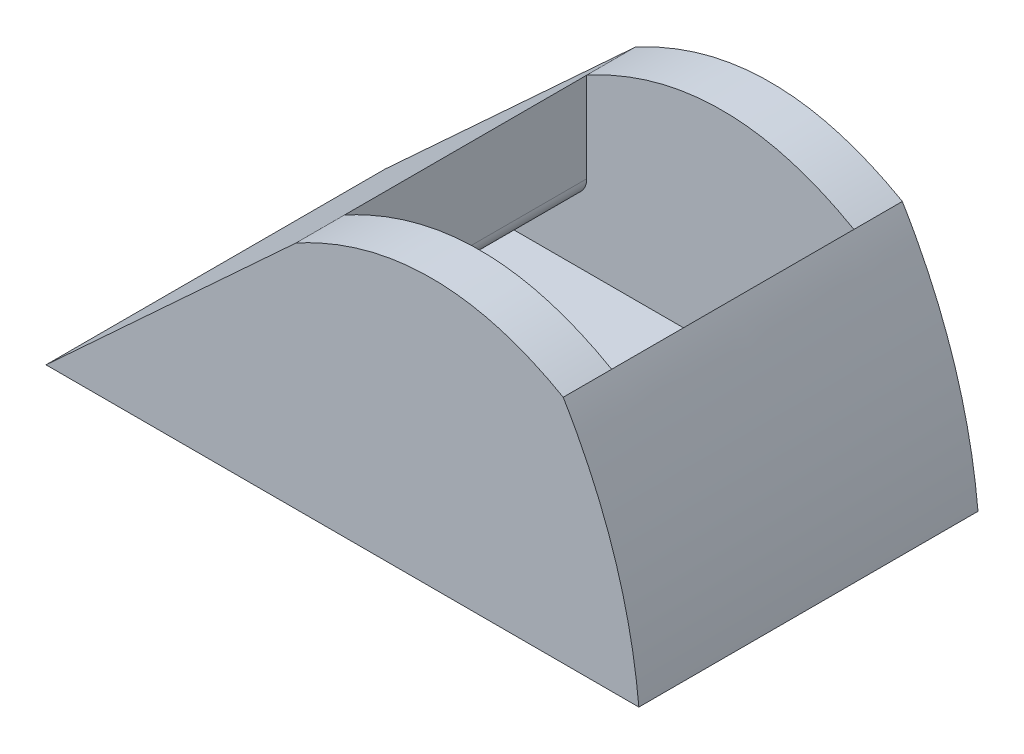
ISO-10303-21;
HEADER;
FILE_DESCRIPTION(('STEP AP214'),'2;1');
FILE_NAME('part.step','',(''),(''),'','','');
FILE_SCHEMA(('AUTOMOTIVE_DESIGN { 1 0 10303 214 1 1 1 1 }'));
ENDSEC;
DATA;
#1=APPLICATION_CONTEXT('core data for automotive mechanical design processes');
#2=APPLICATION_PROTOCOL_DEFINITION('international standard','automotive_design',2000,#1);
#3=PRODUCT_CONTEXT('',#1,'mechanical');
#4=PRODUCT('Part','Part','',(#3));
#5=PRODUCT_RELATED_PRODUCT_CATEGORY('part','',(#4));
#6=PRODUCT_DEFINITION_FORMATION('','',#4);
#7=PRODUCT_DEFINITION_CONTEXT('part definition',#1,'design');
#8=PRODUCT_DEFINITION('design','',#6,#7);
#9=PRODUCT_DEFINITION_SHAPE('','',#8);
#10=(LENGTH_UNIT() NAMED_UNIT(*) SI_UNIT(.MILLI.,.METRE.));
#11=(NAMED_UNIT(*) PLANE_ANGLE_UNIT() SI_UNIT($,.RADIAN.));
#12=(NAMED_UNIT(*) SI_UNIT($,.STERADIAN.) SOLID_ANGLE_UNIT());
#13=UNCERTAINTY_MEASURE_WITH_UNIT(LENGTH_MEASURE(1.E-05),#10,'distance_accuracy_value','');
#14=(GEOMETRIC_REPRESENTATION_CONTEXT(3) GLOBAL_UNCERTAINTY_ASSIGNED_CONTEXT((#13)) GLOBAL_UNIT_ASSIGNED_CONTEXT((#10,
#11,#12)) REPRESENTATION_CONTEXT('',''));
#15=CARTESIAN_POINT('',(0.,0.,0.));
#16=DIRECTION('',(0.,0.,1.));
#17=DIRECTION('',(1.,0.,0.));
#18=AXIS2_PLACEMENT_3D('',#15,#16,#17);
#19=CARTESIAN_POINT('',(815.348837323929,351.768416644521,-350.));
#20=CARTESIAN_POINT('',(546.111311766551,505.694887207858,-350.));
#21=CARTESIAN_POINT('',(263.900031848232,351.768416644528,-350.));
#22=B_SPLINE_CURVE_WITH_KNOTS('',2,(#19,#20,#21),.UNSPECIFIED.,.F.,.F.,(3,3),(0.,1.),.UNSPECIFIED.);
#23=DIRECTION('',(0.,0.,1.));
#24=VECTOR('',#23,1.);
#25=SURFACE_OF_LINEAR_EXTRUSION('',#22,#24);
#26=DIRECTION('',(0.,0.,1.));
#27=VECTOR('',#26,1.);
#28=CARTESIAN_POINT('',(263.900031848232,351.768416644528,-350.));
#29=LINE('',#28,#27);
#30=CARTESIAN_POINT('',(263.900031848232,351.768416644528,-350.));
#31=VERTEX_POINT('',#30);
#32=CARTESIAN_POINT('',(263.900031848232,351.768416644528,-250.));
#33=VERTEX_POINT('',#32);
#34=EDGE_CURVE('E341',#31,#33,#29,.T.);
#35=ORIENTED_EDGE('',*,*,#34,.T.);
#36=CARTESIAN_POINT('',(815.348837323929,351.768416644521,-250.));
#37=CARTESIAN_POINT('',(546.111311766551,505.694887207858,-250.));
#38=CARTESIAN_POINT('',(263.900031848232,351.768416644528,-250.));
#39=B_SPLINE_CURVE_WITH_KNOTS('',2,(#36,#37,#38),.UNSPECIFIED.,.F.,.F.,(3,3),(0.,1.),.UNSPECIFIED.);
#40=CARTESIAN_POINT('',(815.348837323929,351.768416644521,-250.));
#41=VERTEX_POINT('',#40);
#42=EDGE_CURVE('E175',#41,#33,#39,.T.);
#43=ORIENTED_EDGE('',*,*,#42,.F.);
#44=DIRECTION('',(0.,0.,1.));
#45=VECTOR('',#44,1.);
#46=CARTESIAN_POINT('',(815.348837323929,351.768416644521,-350.));
#47=LINE('',#46,#45);
#48=CARTESIAN_POINT('',(815.348837323929,351.768416644521,-350.));
#49=VERTEX_POINT('',#48);
#50=EDGE_CURVE('E48',#49,#41,#47,.T.);
#51=ORIENTED_EDGE('',*,*,#50,.F.);
#52=EDGE_CURVE('E268',#49,#31,#22,.T.);
#53=ORIENTED_EDGE('',*,*,#52,.T.);
#54=EDGE_LOOP('',(#35,#43,#51,#53));
#55=FACE_BOUND('',#54,.T.);
#56=ADVANCED_FACE('F43',(#55),#25,.T.);
#57=CARTESIAN_POINT('',(971.509879636091,-124.075068781744,-350.));
#58=CARTESIAN_POINT('',(947.510823836833,130.321252054086,-350.));
#59=CARTESIAN_POINT('',(815.348837323929,351.768416644521,-350.));
#60=B_SPLINE_CURVE_WITH_KNOTS('',2,(#57,#58,#59),.UNSPECIFIED.,.F.,.F.,(3,3),(0.,1.),.UNSPECIFIED.);
#61=DIRECTION('',(0.,0.,1.));
#62=VECTOR('',#61,1.);
#63=SURFACE_OF_LINEAR_EXTRUSION('',#60,#62);
#64=ORIENTED_EDGE('',*,*,#50,.T.);
#65=DIRECTION('',(0.,0.,-1.));
#66=VECTOR('',#65,1.);
#67=CARTESIAN_POINT('',(815.348837323929,351.768416644521,250.));
#68=LINE('',#67,#66);
#69=CARTESIAN_POINT('',(815.348837323929,351.768416644521,250.));
#70=VERTEX_POINT('',#69);
#71=EDGE_CURVE('E227',#70,#41,#68,.T.);
#72=ORIENTED_EDGE('',*,*,#71,.F.);
#73=CARTESIAN_POINT('',(815.348837323929,351.768416644521,350.));
#74=VERTEX_POINT('',#73);
#75=EDGE_CURVE('E354',#70,#74,#47,.T.);
#76=ORIENTED_EDGE('',*,*,#75,.T.);
#77=CARTESIAN_POINT('',(971.509879636091,-124.075068781744,350.));
#78=CARTESIAN_POINT('',(947.510823836833,130.321252054086,350.));
#79=CARTESIAN_POINT('',(815.348837323929,351.768416644521,350.));
#80=B_SPLINE_CURVE_WITH_KNOTS('',2,(#77,#78,#79),.UNSPECIFIED.,.F.,.F.,(3,3),(0.,1.),.UNSPECIFIED.);
#81=CARTESIAN_POINT('',(971.509879636091,-124.075068781744,350.));
#82=VERTEX_POINT('',#81);
#83=EDGE_CURVE('E149',#82,#74,#80,.T.);
#84=ORIENTED_EDGE('',*,*,#83,.F.);
#85=DIRECTION('',(0.,0.,1.));
#86=VECTOR('',#85,1.);
#87=CARTESIAN_POINT('',(971.509879636091,-124.075068781744,-350.));
#88=LINE('',#87,#86);
#89=CARTESIAN_POINT('',(971.509879636091,-124.075068781744,-350.));
#90=VERTEX_POINT('',#89);
#91=EDGE_CURVE('E11',#90,#82,#88,.T.);
#92=ORIENTED_EDGE('',*,*,#91,.F.);
#93=EDGE_CURVE('E262',#90,#49,#60,.T.);
#94=ORIENTED_EDGE('',*,*,#93,.T.);
#95=EDGE_LOOP('',(#64,#72,#76,#84,#92,#94));
#96=FACE_BOUND('',#95,.T.);
#97=ADVANCED_FACE('F45',(#96),#63,.T.);
#98=CARTESIAN_POINT('',(971.509879636091,-124.075068781744,-350.));
#99=DIRECTION('',(0.,-1.,0.));
#100=DIRECTION('',(0.,0.,-1.));
#101=AXIS2_PLACEMENT_3D('',#98,#99,#100);
#102=PLANE('',#101);
#103=ORIENTED_EDGE('',*,*,#91,.T.);
#104=DIRECTION('',(1.,0.,0.));
#105=VECTOR('',#104,1.);
#106=CARTESIAN_POINT('',(971.509879636091,-124.075068781744,350.));
#107=LINE('',#106,#105);
#108=CARTESIAN_POINT('',(-252.203431312566,-124.075068781744,350.));
#109=VERTEX_POINT('',#108);
#110=EDGE_CURVE('E259',#109,#82,#107,.T.);
#111=ORIENTED_EDGE('',*,*,#110,.F.);
#112=DIRECTION('',(0.,0.,1.));
#113=VECTOR('',#112,1.);
#114=CARTESIAN_POINT('',(-252.203431312566,-124.075068781744,-350.));
#115=LINE('',#114,#113);
#116=CARTESIAN_POINT('',(-252.203431312566,-124.075068781744,-350.));
#117=VERTEX_POINT('',#116);
#118=EDGE_CURVE('E54',#117,#109,#115,.T.);
#119=ORIENTED_EDGE('',*,*,#118,.F.);
#120=DIRECTION('',(1.,0.,0.));
#121=VECTOR('',#120,1.);
#122=CARTESIAN_POINT('',(971.509879636091,-124.075068781744,-350.));
#123=LINE('',#122,#121);
#124=EDGE_CURVE('E351',#117,#90,#123,.T.);
#125=ORIENTED_EDGE('',*,*,#124,.T.);
#126=EDGE_LOOP('',(#103,#111,#119,#125));
#127=FACE_BOUND('',#126,.T.);
#128=ADVANCED_FACE('F291',(#127),#102,.T.);
#129=CARTESIAN_POINT('',(-252.203431312566,-124.075068781744,-350.));
#130=DIRECTION('',(-0.677849483888009,0.735200705381027,0.));
#131=DIRECTION('',(-0.735200705381027,-0.677849483888009,0.));
#132=AXIS2_PLACEMENT_3D('',#129,#130,#131);
#133=PLANE('',#132);
#134=ORIENTED_EDGE('',*,*,#118,.T.);
#135=DIRECTION('',(-0.735200705381027,-0.677849483888009,0.));
#136=VECTOR('',#135,1.);
#137=CARTESIAN_POINT('',(-252.203431312566,-124.075068781744,350.));
#138=LINE('',#137,#136);
#139=CARTESIAN_POINT('',(263.900031848232,351.768416644528,350.));
#140=VERTEX_POINT('',#139);
#141=EDGE_CURVE('E252',#140,#109,#138,.T.);
#142=ORIENTED_EDGE('',*,*,#141,.F.);
#143=CARTESIAN_POINT('',(263.900031848232,351.768416644528,250.));
#144=VERTEX_POINT('',#143);
#145=EDGE_CURVE('E347',#144,#140,#29,.T.);
#146=ORIENTED_EDGE('',*,*,#145,.F.);
#147=DIRECTION('',(0.,0.,-1.));
#148=VECTOR('',#147,1.);
#149=CARTESIAN_POINT('',(263.900031848232,351.768416644528,250.));
#150=LINE('',#149,#148);
#151=EDGE_CURVE('E223',#144,#33,#150,.T.);
#152=ORIENTED_EDGE('',*,*,#151,.T.);
#153=ORIENTED_EDGE('',*,*,#34,.F.);
#154=DIRECTION('',(-0.735200705381027,-0.677849483888009,0.));
#155=VECTOR('',#154,1.);
#156=CARTESIAN_POINT('',(-252.203431312566,-124.075068781744,-350.));
#157=LINE('',#156,#155);
#158=EDGE_CURVE('E278',#31,#117,#157,.T.);
#159=ORIENTED_EDGE('',*,*,#158,.T.);
#160=EDGE_LOOP('',(#134,#142,#146,#152,#153,#159));
#161=FACE_BOUND('',#160,.T.);
#162=ADVANCED_FACE('F287',(#161),#133,.T.);
#163=CARTESIAN_POINT('',(815.348837323929,351.768416644521,250.));
#164=CARTESIAN_POINT('',(546.111311766551,505.694887207858,250.));
#165=CARTESIAN_POINT('',(263.900031848232,351.768416644528,250.));
#166=B_SPLINE_CURVE_WITH_KNOTS('',2,(#163,#164,#165),.UNSPECIFIED.,.F.,.F.,(3,3),(0.,1.),.UNSPECIFIED.);
#167=EDGE_CURVE('E202',#70,#144,#166,.T.);
#168=ORIENTED_EDGE('',*,*,#167,.T.);
#169=ORIENTED_EDGE('',*,*,#145,.T.);
#170=CARTESIAN_POINT('',(815.348837323929,351.768416644521,350.));
#171=CARTESIAN_POINT('',(546.111311766551,505.694887207858,350.));
#172=CARTESIAN_POINT('',(263.900031848232,351.768416644528,350.));
#173=B_SPLINE_CURVE_WITH_KNOTS('',2,(#170,#171,#172),.UNSPECIFIED.,.F.,.F.,(3,3),(0.,1.),.UNSPECIFIED.);
#174=EDGE_CURVE('E243',#74,#140,#173,.T.);
#175=ORIENTED_EDGE('',*,*,#174,.F.);
#176=ORIENTED_EDGE('',*,*,#75,.F.);
#177=EDGE_LOOP('',(#168,#169,#175,#176));
#178=FACE_BOUND('',#177,.T.);
#179=ADVANCED_FACE('F283',(#178),#25,.T.);
#180=CARTESIAN_POINT('',(920.470091158421,122.083962992737,-350.));
#181=DIRECTION('',(0.,0.,1.));
#182=DIRECTION('',(1.,0.,0.));
#183=AXIS2_PLACEMENT_3D('',#180,#181,#182);
#184=PLANE('',#183);
#185=ORIENTED_EDGE('',*,*,#93,.F.);
#186=ORIENTED_EDGE('',*,*,#124,.F.);
#187=ORIENTED_EDGE('',*,*,#158,.F.);
#188=ORIENTED_EDGE('',*,*,#52,.F.);
#189=EDGE_LOOP('',(#185,#186,#187,#188));
#190=FACE_BOUND('',#189,.T.);
#191=ADVANCED_FACE('F286',(#190),#184,.F.);
#192=CARTESIAN_POINT('',(920.470091158421,122.083962992737,350.));
#193=DIRECTION('',(0.,0.,1.));
#194=DIRECTION('',(1.,0.,0.));
#195=AXIS2_PLACEMENT_3D('',#192,#193,#194);
#196=PLANE('',#195);
#197=ORIENTED_EDGE('',*,*,#83,.T.);
#198=ORIENTED_EDGE('',*,*,#174,.T.);
#199=ORIENTED_EDGE('',*,*,#141,.T.);
#200=ORIENTED_EDGE('',*,*,#110,.T.);
#201=EDGE_LOOP('',(#197,#198,#199,#200));
#202=FACE_BOUND('',#201,.T.);
#203=ADVANCED_FACE('F298',(#202),#196,.T.);
#204=CARTESIAN_POINT('',(242.923653744532,131.336316240802,250.));
#205=DIRECTION('',(0.475590547407494,-0.879666772827439,0.));
#206=DIRECTION('',(0.879666772827439,0.475590547407494,0.));
#207=AXIS2_PLACEMENT_3D('',#204,#205,#206);
#208=PLANE('',#207);
#209=DIRECTION('',(0.,0.,-1.));
#210=VECTOR('',#209,1.);
#211=CARTESIAN_POINT('',(242.923653744532,131.336316240802,250.));
#212=LINE('',#211,#210);
#213=CARTESIAN_POINT('',(242.923653744532,131.336316240802,250.));
#214=VERTEX_POINT('',#213);
#215=CARTESIAN_POINT('',(242.923653744532,131.336316240802,-250.));
#216=VERTEX_POINT('',#215);
#217=EDGE_CURVE('E217',#214,#216,#212,.T.);
#218=ORIENTED_EDGE('',*,*,#217,.F.);
#219=DIRECTION('',(-0.879666772827439,-0.475590547407494,0.));
#220=VECTOR('',#219,1.);
#221=CARTESIAN_POINT('',(242.923653744532,131.336316240802,250.));
#222=LINE('',#221,#220);
#223=CARTESIAN_POINT('',(0.,0.,250.));
#224=VERTEX_POINT('',#223);
#225=EDGE_CURVE('E146',#214,#224,#222,.T.);
#226=ORIENTED_EDGE('',*,*,#225,.T.);
#227=DIRECTION('',(0.,0.,-1.));
#228=VECTOR('',#227,1.);
#229=CARTESIAN_POINT('',(0.,0.,250.));
#230=LINE('',#229,#228);
#231=CARTESIAN_POINT('',(0.,0.,-250.));
#232=VERTEX_POINT('',#231);
#233=EDGE_CURVE('E138',#224,#232,#230,.T.);
#234=ORIENTED_EDGE('',*,*,#233,.T.);
#235=DIRECTION('',(-0.879666772827439,-0.475590547407494,0.));
#236=VECTOR('',#235,1.);
#237=CARTESIAN_POINT('',(242.923653744532,131.336316240802,-250.));
#238=LINE('',#237,#236);
#239=EDGE_CURVE('E143',#216,#232,#238,.T.);
#240=ORIENTED_EDGE('',*,*,#239,.F.);
#241=EDGE_LOOP('',(#218,#226,#234,#240));
#242=FACE_BOUND('',#241,.T.);
#243=ADVANCED_FACE('F141',(#242),#208,.T.);
#244=CARTESIAN_POINT('',(0.,0.,250.));
#245=DIRECTION('',(0.,1.,0.));
#246=DIRECTION('',(0.,0.,1.));
#247=AXIS2_PLACEMENT_3D('',#244,#245,#246);
#248=PLANE('',#247);
#249=ORIENTED_EDGE('',*,*,#233,.F.);
#250=DIRECTION('',(1.,0.,0.));
#251=VECTOR('',#250,1.);
#252=CARTESIAN_POINT('',(0.,0.,250.));
#253=LINE('',#252,#251);
#254=CARTESIAN_POINT('',(672.171335821088,0.,250.));
#255=VERTEX_POINT('',#254);
#256=EDGE_CURVE('E190',#224,#255,#253,.T.);
#257=ORIENTED_EDGE('',*,*,#256,.T.);
#258=DIRECTION('',(0.,0.,-1.));
#259=VECTOR('',#258,1.);
#260=CARTESIAN_POINT('',(672.171335821088,0.,250.));
#261=LINE('',#260,#259);
#262=CARTESIAN_POINT('',(672.171335821088,0.,-250.));
#263=VERTEX_POINT('',#262);
#264=EDGE_CURVE('E150',#255,#263,#261,.T.);
#265=ORIENTED_EDGE('',*,*,#264,.T.);
#266=DIRECTION('',(1.,0.,0.));
#267=VECTOR('',#266,1.);
#268=CARTESIAN_POINT('',(0.,0.,-250.));
#269=LINE('',#268,#267);
#270=EDGE_CURVE('E153',#232,#263,#269,.T.);
#271=ORIENTED_EDGE('',*,*,#270,.F.);
#272=EDGE_LOOP('',(#249,#257,#265,#271));
#273=FACE_BOUND('',#272,.T.);
#274=ADVANCED_FACE('F154',(#273),#248,.T.);
#275=CARTESIAN_POINT('',(672.171335821088,40.,250.));
#276=DIRECTION('',(0.,0.,-1.));
#277=DIRECTION('',(-1.,0.,0.));
#278=AXIS2_PLACEMENT_3D('',#275,#276,#277);
#279=CYLINDRICAL_SURFACE('',#278,39.9999999999999);
#280=ORIENTED_EDGE('',*,*,#264,.F.);
#281=CARTESIAN_POINT('',(672.171335821088,40.,250.));
#282=DIRECTION('',(0.,0.,1.));
#283=DIRECTION('',(1.,0.,0.));
#284=AXIS2_PLACEMENT_3D('',#281,#282,#283);
#285=CIRCLE('',#284,39.9999999999999);
#286=CARTESIAN_POINT('',(709.675728339791,26.0924286159266,250.));
#287=VERTEX_POINT('',#286);
#288=EDGE_CURVE('E193',#255,#287,#285,.T.);
#289=ORIENTED_EDGE('',*,*,#288,.T.);
#290=DIRECTION('',(0.,0.,-1.));
#291=VECTOR('',#290,1.);
#292=CARTESIAN_POINT('',(709.675728339791,26.0924286159266,250.));
#293=LINE('',#292,#291);
#294=CARTESIAN_POINT('',(709.675728339791,26.0924286159266,-250.));
#295=VERTEX_POINT('',#294);
#296=EDGE_CURVE('E233',#287,#295,#293,.T.);
#297=ORIENTED_EDGE('',*,*,#296,.T.);
#298=CARTESIAN_POINT('',(672.171335821088,40.,-250.));
#299=DIRECTION('',(0.,0.,1.));
#300=DIRECTION('',(1.,0.,0.));
#301=AXIS2_PLACEMENT_3D('',#298,#299,#300);
#302=CIRCLE('',#301,39.9999999999999);
#303=EDGE_CURVE('E159',#263,#295,#302,.T.);
#304=ORIENTED_EDGE('',*,*,#303,.F.);
#305=EDGE_LOOP('',(#280,#289,#297,#304));
#306=FACE_BOUND('',#305,.T.);
#307=ADVANCED_FACE('F307',(#306),#279,.F.);
#308=CARTESIAN_POINT('',(818.005303321357,318.223584321919,250.));
#309=DIRECTION('',(-0.937609812967563,0.347689284601829,0.));
#310=DIRECTION('',(-0.347689284601829,-0.937609812967563,0.));
#311=AXIS2_PLACEMENT_3D('',#308,#309,#310);
#312=PLANE('',#311);
#313=ORIENTED_EDGE('',*,*,#296,.F.);
#314=DIRECTION('',(0.347689284601829,0.937609812967563,0.));
#315=VECTOR('',#314,1.);
#316=CARTESIAN_POINT('',(818.005303321357,318.223584321919,250.));
#317=LINE('',#316,#315);
#318=CARTESIAN_POINT('',(818.005303321357,318.223584321919,250.));
#319=VERTEX_POINT('',#318);
#320=EDGE_CURVE('E196',#287,#319,#317,.T.);
#321=ORIENTED_EDGE('',*,*,#320,.T.);
#322=DIRECTION('',(0.,0.,-1.));
#323=VECTOR('',#322,1.);
#324=CARTESIAN_POINT('',(818.005303321357,318.223584321919,250.));
#325=LINE('',#324,#323);
#326=CARTESIAN_POINT('',(818.005303321357,318.223584321919,-250.));
#327=VERTEX_POINT('',#326);
#328=EDGE_CURVE('E230',#319,#327,#325,.T.);
#329=ORIENTED_EDGE('',*,*,#328,.T.);
#330=DIRECTION('',(0.347689284601829,0.937609812967563,0.));
#331=VECTOR('',#330,1.);
#332=CARTESIAN_POINT('',(818.005303321357,318.223584321919,-250.));
#333=LINE('',#332,#331);
#334=EDGE_CURVE('E170',#295,#327,#333,.T.);
#335=ORIENTED_EDGE('',*,*,#334,.F.);
#336=EDGE_LOOP('',(#313,#321,#329,#335));
#337=FACE_BOUND('',#336,.T.);
#338=ADVANCED_FACE('F310',(#337),#312,.T.);
#339=CARTESIAN_POINT('',(780.500910802655,332.131155705993,250.));
#340=DIRECTION('',(0.,0.,-1.));
#341=DIRECTION('',(-1.,0.,0.));
#342=AXIS2_PLACEMENT_3D('',#339,#340,#341);
#343=CYLINDRICAL_SURFACE('',#342,39.9999999999998);
#344=ORIENTED_EDGE('',*,*,#328,.F.);
#345=CARTESIAN_POINT('',(780.500910802655,332.131155705993,250.));
#346=DIRECTION('',(0.,0.,1.));
#347=DIRECTION('',(-1.,0.,0.));
#348=AXIS2_PLACEMENT_3D('',#345,#346,#347);
#349=CIRCLE('',#348,39.9999999999998);
#350=EDGE_CURVE('E199',#319,#70,#349,.T.);
#351=ORIENTED_EDGE('',*,*,#350,.T.);
#352=ORIENTED_EDGE('',*,*,#71,.T.);
#353=CARTESIAN_POINT('',(780.500910802655,332.131155705993,-250.));
#354=DIRECTION('',(0.,0.,1.));
#355=DIRECTION('',(-1.,0.,0.));
#356=AXIS2_PLACEMENT_3D('',#353,#354,#355);
#357=CIRCLE('',#356,39.9999999999998);
#358=EDGE_CURVE('E62',#327,#41,#357,.T.);
#359=ORIENTED_EDGE('',*,*,#358,.F.);
#360=EDGE_LOOP('',(#344,#351,#352,#359));
#361=FACE_BOUND('',#360,.T.);
#362=ADVANCED_FACE('F314',(#361),#343,.F.);
#363=CARTESIAN_POINT('',(263.900031848232,351.768416644528,250.));
#364=DIRECTION('',(1.,0.,0.));
#365=DIRECTION('',(0.,0.,-1.));
#366=AXIS2_PLACEMENT_3D('',#363,#364,#365);
#367=PLANE('',#366);
#368=ORIENTED_EDGE('',*,*,#151,.F.);
#369=DIRECTION('',(0.,-1.,0.));
#370=VECTOR('',#369,1.);
#371=CARTESIAN_POINT('',(263.900031848232,351.768416644528,250.));
#372=LINE('',#371,#370);
#373=CARTESIAN_POINT('',(263.900031848232,166.522987153899,250.));
#374=VERTEX_POINT('',#373);
#375=EDGE_CURVE('E208',#144,#374,#372,.T.);
#376=ORIENTED_EDGE('',*,*,#375,.T.);
#377=DIRECTION('',(0.,0.,-1.));
#378=VECTOR('',#377,1.);
#379=CARTESIAN_POINT('',(263.900031848232,166.522987153899,250.));
#380=LINE('',#379,#378);
#381=CARTESIAN_POINT('',(263.900031848232,166.522987153899,-250.));
#382=VERTEX_POINT('',#381);
#383=EDGE_CURVE('E220',#374,#382,#380,.T.);
#384=ORIENTED_EDGE('',*,*,#383,.T.);
#385=DIRECTION('',(0.,-1.,0.));
#386=VECTOR('',#385,1.);
#387=CARTESIAN_POINT('',(263.900031848232,351.768416644528,-250.));
#388=LINE('',#387,#386);
#389=EDGE_CURVE('E180',#33,#382,#388,.T.);
#390=ORIENTED_EDGE('',*,*,#389,.F.);
#391=EDGE_LOOP('',(#368,#376,#384,#390));
#392=FACE_BOUND('',#391,.T.);
#393=ADVANCED_FACE('F318',(#392),#367,.T.);
#394=CARTESIAN_POINT('',(223.900031848232,166.522987153899,250.));
#395=DIRECTION('',(0.,0.,-1.));
#396=DIRECTION('',(-1.,0.,0.));
#397=AXIS2_PLACEMENT_3D('',#394,#395,#396);
#398=CYLINDRICAL_SURFACE('',#397,39.9999999999996);
#399=ORIENTED_EDGE('',*,*,#383,.F.);
#400=CARTESIAN_POINT('',(223.900031848232,166.522987153899,250.));
#401=DIRECTION('',(0.,0.,-1.));
#402=DIRECTION('',(-1.,0.,0.));
#403=AXIS2_PLACEMENT_3D('',#400,#401,#402);
#404=CIRCLE('',#403,39.9999999999996);
#405=EDGE_CURVE('E214',#374,#214,#404,.T.);
#406=ORIENTED_EDGE('',*,*,#405,.T.);
#407=ORIENTED_EDGE('',*,*,#217,.T.);
#408=CARTESIAN_POINT('',(223.900031848232,166.522987153899,-250.));
#409=DIRECTION('',(0.,0.,-1.));
#410=DIRECTION('',(-1.,0.,0.));
#411=AXIS2_PLACEMENT_3D('',#408,#409,#410);
#412=CIRCLE('',#411,39.9999999999996);
#413=EDGE_CURVE('E164',#382,#216,#412,.T.);
#414=ORIENTED_EDGE('',*,*,#413,.F.);
#415=EDGE_LOOP('',(#399,#406,#407,#414));
#416=FACE_BOUND('',#415,.T.);
#417=ADVANCED_FACE('F322',(#416),#398,.T.);
#418=CARTESIAN_POINT('',(672.171335821088,40.,250.));
#419=DIRECTION('',(0.,0.,1.));
#420=DIRECTION('',(1.,0.,0.));
#421=AXIS2_PLACEMENT_3D('',#418,#419,#420);
#422=PLANE('',#421);
#423=ORIENTED_EDGE('',*,*,#225,.F.);
#424=ORIENTED_EDGE('',*,*,#405,.F.);
#425=ORIENTED_EDGE('',*,*,#375,.F.);
#426=ORIENTED_EDGE('',*,*,#167,.F.);
#427=ORIENTED_EDGE('',*,*,#350,.F.);
#428=ORIENTED_EDGE('',*,*,#320,.F.);
#429=ORIENTED_EDGE('',*,*,#288,.F.);
#430=ORIENTED_EDGE('',*,*,#256,.F.);
#431=EDGE_LOOP('',(#423,#424,#425,#426,#427,#428,#429,#430));
#432=FACE_BOUND('',#431,.T.);
#433=ADVANCED_FACE('F326',(#432),#422,.F.);
#434=CARTESIAN_POINT('',(672.171335821088,40.,-250.));
#435=DIRECTION('',(0.,0.,1.));
#436=DIRECTION('',(1.,0.,0.));
#437=AXIS2_PLACEMENT_3D('',#434,#435,#436);
#438=PLANE('',#437);
#439=ORIENTED_EDGE('',*,*,#239,.T.);
#440=ORIENTED_EDGE('',*,*,#270,.T.);
#441=ORIENTED_EDGE('',*,*,#303,.T.);
#442=ORIENTED_EDGE('',*,*,#334,.T.);
#443=ORIENTED_EDGE('',*,*,#358,.T.);
#444=ORIENTED_EDGE('',*,*,#42,.T.);
#445=ORIENTED_EDGE('',*,*,#389,.T.);
#446=ORIENTED_EDGE('',*,*,#413,.T.);
#447=EDGE_LOOP('',(#439,#440,#441,#442,#443,#444,#445,#446));
#448=FACE_BOUND('',#447,.T.);
#449=ADVANCED_FACE('F161',(#448),#438,.T.);
#450=CLOSED_SHELL('',(#56,#97,#128,#162,#179,#191,#203,#243,#274,#307,#338,#362,#393,#417,#433,#449));
#451=MANIFOLD_SOLID_BREP('B2',#450);
#452=ADVANCED_BREP_SHAPE_REPRESENTATION('',(#18,#451),#14);
#453=SHAPE_DEFINITION_REPRESENTATION(#9,#452);
ENDSEC;
END-ISO-10303-21;
